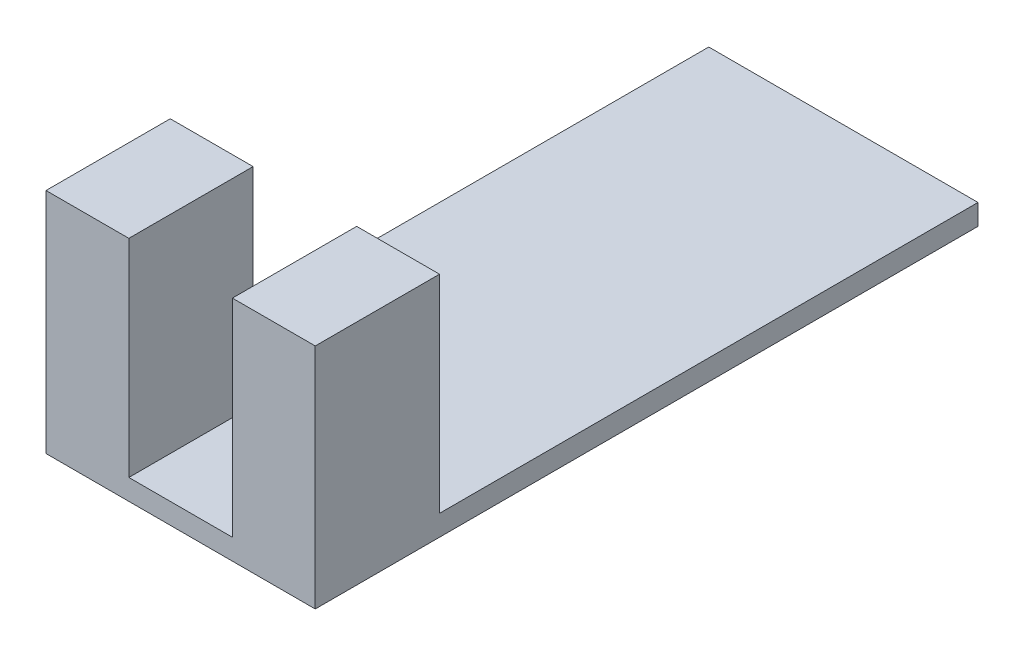
ISO-10303-21;
HEADER;
FILE_DESCRIPTION(('STEP AP214'),'2;1');
FILE_NAME('part.step','',(''),(''),'','','');
FILE_SCHEMA(('AUTOMOTIVE_DESIGN { 1 0 10303 214 1 1 1 1 }'));
ENDSEC;
DATA;
#1=APPLICATION_CONTEXT('core data for automotive mechanical design processes');
#2=APPLICATION_PROTOCOL_DEFINITION('international standard','automotive_design',2000,#1);
#3=PRODUCT_CONTEXT('',#1,'mechanical');
#4=PRODUCT('Part','Part','',(#3));
#5=PRODUCT_RELATED_PRODUCT_CATEGORY('part','',(#4));
#6=PRODUCT_DEFINITION_FORMATION('','',#4);
#7=PRODUCT_DEFINITION_CONTEXT('part definition',#1,'design');
#8=PRODUCT_DEFINITION('design','',#6,#7);
#9=PRODUCT_DEFINITION_SHAPE('','',#8);
#10=(LENGTH_UNIT() NAMED_UNIT(*) SI_UNIT(.MILLI.,.METRE.));
#11=(NAMED_UNIT(*) PLANE_ANGLE_UNIT() SI_UNIT($,.RADIAN.));
#12=(NAMED_UNIT(*) SI_UNIT($,.STERADIAN.) SOLID_ANGLE_UNIT());
#13=UNCERTAINTY_MEASURE_WITH_UNIT(LENGTH_MEASURE(1.E-05),#10,'distance_accuracy_value','');
#14=(GEOMETRIC_REPRESENTATION_CONTEXT(3) GLOBAL_UNCERTAINTY_ASSIGNED_CONTEXT((#13)) GLOBAL_UNIT_ASSIGNED_CONTEXT((#10,
#11,#12)) REPRESENTATION_CONTEXT('',''));
#15=CARTESIAN_POINT('',(0.,0.,0.));
#16=DIRECTION('',(0.,0.,1.));
#17=DIRECTION('',(1.,0.,0.));
#18=AXIS2_PLACEMENT_3D('',#15,#16,#17);
#19=CARTESIAN_POINT('',(0.,1.,0.));
#20=DIRECTION('',(1.,0.,0.));
#21=DIRECTION('',(0.,0.,-1.));
#22=AXIS2_PLACEMENT_3D('',#19,#20,#21);
#23=PLANE('',#22);
#24=DIRECTION('',(0.,0.,1.));
#25=VECTOR('',#24,1.);
#26=CARTESIAN_POINT('',(0.,0.,0.));
#27=LINE('',#26,#25);
#28=CARTESIAN_POINT('',(0.,0.,0.));
#29=VERTEX_POINT('',#28);
#30=CARTESIAN_POINT('',(0.,0.,32.));
#31=VERTEX_POINT('',#30);
#32=EDGE_CURVE('E138',#29,#31,#27,.T.);
#33=ORIENTED_EDGE('',*,*,#32,.T.);
#34=DIRECTION('',(0.,-1.,0.));
#35=VECTOR('',#34,1.);
#36=CARTESIAN_POINT('',(0.,1.,32.));
#37=LINE('',#36,#35);
#38=CARTESIAN_POINT('',(0.,11.,32.));
#39=VERTEX_POINT('',#38);
#40=EDGE_CURVE('E11',#39,#31,#37,.T.);
#41=ORIENTED_EDGE('',*,*,#40,.F.);
#42=DIRECTION('',(0.,0.,1.));
#43=VECTOR('',#42,1.);
#44=CARTESIAN_POINT('',(0.,11.,32.));
#45=LINE('',#44,#43);
#46=CARTESIAN_POINT('',(0.,11.,26.));
#47=VERTEX_POINT('',#46);
#48=EDGE_CURVE('E162',#47,#39,#45,.T.);
#49=ORIENTED_EDGE('',*,*,#48,.F.);
#50=DIRECTION('',(0.,-1.,0.));
#51=VECTOR('',#50,1.);
#52=CARTESIAN_POINT('',(0.,11.,26.));
#53=LINE('',#52,#51);
#54=CARTESIAN_POINT('',(0.,1.,26.));
#55=VERTEX_POINT('',#54);
#56=EDGE_CURVE('E153',#47,#55,#53,.T.);
#57=ORIENTED_EDGE('',*,*,#56,.T.);
#58=DIRECTION('',(0.,0.,1.));
#59=VECTOR('',#58,1.);
#60=CARTESIAN_POINT('',(0.,1.,0.));
#61=LINE('',#60,#59);
#62=CARTESIAN_POINT('',(0.,1.,0.));
#63=VERTEX_POINT('',#62);
#64=EDGE_CURVE('E173',#63,#55,#61,.T.);
#65=ORIENTED_EDGE('',*,*,#64,.F.);
#66=DIRECTION('',(0.,-1.,0.));
#67=VECTOR('',#66,1.);
#68=CARTESIAN_POINT('',(0.,1.,0.));
#69=LINE('',#68,#67);
#70=EDGE_CURVE('E180',#63,#29,#69,.T.);
#71=ORIENTED_EDGE('',*,*,#70,.T.);
#72=EDGE_LOOP('',(#33,#41,#49,#57,#65,#71));
#73=FACE_BOUND('',#72,.T.);
#74=ADVANCED_FACE('F39',(#73),#23,.F.);
#75=CARTESIAN_POINT('',(0.,1.,32.));
#76=DIRECTION('',(0.,0.,-1.));
#77=DIRECTION('',(-1.,0.,0.));
#78=AXIS2_PLACEMENT_3D('',#75,#76,#77);
#79=PLANE('',#78);
#80=DIRECTION('',(1.,0.,0.));
#81=VECTOR('',#80,1.);
#82=CARTESIAN_POINT('',(0.,0.,32.));
#83=LINE('',#82,#81);
#84=CARTESIAN_POINT('',(13.,0.,32.));
#85=VERTEX_POINT('',#84);
#86=EDGE_CURVE('E141',#31,#85,#83,.T.);
#87=ORIENTED_EDGE('',*,*,#86,.T.);
#88=DIRECTION('',(0.,-1.,0.));
#89=VECTOR('',#88,1.);
#90=CARTESIAN_POINT('',(13.,1.,32.));
#91=LINE('',#90,#89);
#92=CARTESIAN_POINT('',(13.,11.,32.));
#93=VERTEX_POINT('',#92);
#94=EDGE_CURVE('E46',#93,#85,#91,.T.);
#95=ORIENTED_EDGE('',*,*,#94,.F.);
#96=DIRECTION('',(1.,0.,0.));
#97=VECTOR('',#96,1.);
#98=CARTESIAN_POINT('',(13.,11.,32.));
#99=LINE('',#98,#97);
#100=CARTESIAN_POINT('',(9.,11.,32.));
#101=VERTEX_POINT('',#100);
#102=EDGE_CURVE('E127',#101,#93,#99,.T.);
#103=ORIENTED_EDGE('',*,*,#102,.F.);
#104=DIRECTION('',(0.,-1.,0.));
#105=VECTOR('',#104,1.);
#106=CARTESIAN_POINT('',(9.,11.,32.));
#107=LINE('',#106,#105);
#108=CARTESIAN_POINT('',(9.,1.,32.));
#109=VERTEX_POINT('',#108);
#110=EDGE_CURVE('E142',#101,#109,#107,.T.);
#111=ORIENTED_EDGE('',*,*,#110,.T.);
#112=DIRECTION('',(1.,0.,0.));
#113=VECTOR('',#112,1.);
#114=CARTESIAN_POINT('',(0.,1.,32.));
#115=LINE('',#114,#113);
#116=CARTESIAN_POINT('',(4.,1.,32.));
#117=VERTEX_POINT('',#116);
#118=EDGE_CURVE('E56',#117,#109,#115,.T.);
#119=ORIENTED_EDGE('',*,*,#118,.F.);
#120=DIRECTION('',(0.,-1.,0.));
#121=VECTOR('',#120,1.);
#122=CARTESIAN_POINT('',(4.,11.,32.));
#123=LINE('',#122,#121);
#124=CARTESIAN_POINT('',(4.,11.,32.));
#125=VERTEX_POINT('',#124);
#126=EDGE_CURVE('E150',#125,#117,#123,.T.);
#127=ORIENTED_EDGE('',*,*,#126,.F.);
#128=DIRECTION('',(1.,0.,0.));
#129=VECTOR('',#128,1.);
#130=CARTESIAN_POINT('',(0.,11.,32.));
#131=LINE('',#130,#129);
#132=EDGE_CURVE('E167',#39,#125,#131,.T.);
#133=ORIENTED_EDGE('',*,*,#132,.F.);
#134=ORIENTED_EDGE('',*,*,#40,.T.);
#135=EDGE_LOOP('',(#87,#95,#103,#111,#119,#127,#133,#134));
#136=FACE_BOUND('',#135,.T.);
#137=ADVANCED_FACE('F213',(#136),#79,.F.);
#138=CARTESIAN_POINT('',(13.,1.,0.));
#139=DIRECTION('',(-1.,0.,0.));
#140=DIRECTION('',(0.,0.,1.));
#141=AXIS2_PLACEMENT_3D('',#138,#139,#140);
#142=PLANE('',#141);
#143=DIRECTION('',(0.,0.,-1.));
#144=VECTOR('',#143,1.);
#145=CARTESIAN_POINT('',(13.,0.,0.));
#146=LINE('',#145,#144);
#147=CARTESIAN_POINT('',(13.,0.,0.));
#148=VERTEX_POINT('',#147);
#149=EDGE_CURVE('E179',#85,#148,#146,.T.);
#150=ORIENTED_EDGE('',*,*,#149,.T.);
#151=DIRECTION('',(0.,-1.,0.));
#152=VECTOR('',#151,1.);
#153=CARTESIAN_POINT('',(13.,1.,0.));
#154=LINE('',#153,#152);
#155=CARTESIAN_POINT('',(13.,1.,0.));
#156=VERTEX_POINT('',#155);
#157=EDGE_CURVE('E184',#156,#148,#154,.T.);
#158=ORIENTED_EDGE('',*,*,#157,.F.);
#159=DIRECTION('',(0.,0.,-1.));
#160=VECTOR('',#159,1.);
#161=CARTESIAN_POINT('',(13.,1.,0.));
#162=LINE('',#161,#160);
#163=CARTESIAN_POINT('',(13.,1.,26.));
#164=VERTEX_POINT('',#163);
#165=EDGE_CURVE('E140',#164,#156,#162,.T.);
#166=ORIENTED_EDGE('',*,*,#165,.F.);
#167=DIRECTION('',(0.,-1.,0.));
#168=VECTOR('',#167,1.);
#169=CARTESIAN_POINT('',(13.,11.,26.));
#170=LINE('',#169,#168);
#171=CARTESIAN_POINT('',(13.,11.,26.));
#172=VERTEX_POINT('',#171);
#173=EDGE_CURVE('E118',#172,#164,#170,.T.);
#174=ORIENTED_EDGE('',*,*,#173,.F.);
#175=DIRECTION('',(0.,0.,-1.));
#176=VECTOR('',#175,1.);
#177=CARTESIAN_POINT('',(13.,11.,32.));
#178=LINE('',#177,#176);
#179=EDGE_CURVE('E125',#93,#172,#178,.T.);
#180=ORIENTED_EDGE('',*,*,#179,.F.);
#181=ORIENTED_EDGE('',*,*,#94,.T.);
#182=EDGE_LOOP('',(#150,#158,#166,#174,#180,#181));
#183=FACE_BOUND('',#182,.T.);
#184=ADVANCED_FACE('F134',(#183),#142,.F.);
#185=CARTESIAN_POINT('',(0.,1.,0.));
#186=DIRECTION('',(0.,0.,1.));
#187=DIRECTION('',(1.,0.,0.));
#188=AXIS2_PLACEMENT_3D('',#185,#186,#187);
#189=PLANE('',#188);
#190=DIRECTION('',(-1.,0.,0.));
#191=VECTOR('',#190,1.);
#192=CARTESIAN_POINT('',(0.,0.,0.));
#193=LINE('',#192,#191);
#194=EDGE_CURVE('E171',#148,#29,#193,.T.);
#195=ORIENTED_EDGE('',*,*,#194,.T.);
#196=ORIENTED_EDGE('',*,*,#70,.F.);
#197=DIRECTION('',(-1.,0.,0.));
#198=VECTOR('',#197,1.);
#199=CARTESIAN_POINT('',(0.,1.,0.));
#200=LINE('',#199,#198);
#201=EDGE_CURVE('E176',#156,#63,#200,.T.);
#202=ORIENTED_EDGE('',*,*,#201,.F.);
#203=ORIENTED_EDGE('',*,*,#157,.T.);
#204=EDGE_LOOP('',(#195,#196,#202,#203));
#205=FACE_BOUND('',#204,.T.);
#206=ADVANCED_FACE('F193',(#205),#189,.F.);
#207=CARTESIAN_POINT('',(0.,1.,0.));
#208=DIRECTION('',(0.,1.,0.));
#209=DIRECTION('',(0.,0.,1.));
#210=AXIS2_PLACEMENT_3D('',#207,#208,#209);
#211=PLANE('',#210);
#212=DIRECTION('',(0.,0.,1.));
#213=VECTOR('',#212,1.);
#214=CARTESIAN_POINT('',(9.,1.,32.));
#215=LINE('',#214,#213);
#216=CARTESIAN_POINT('',(9.,1.,26.));
#217=VERTEX_POINT('',#216);
#218=EDGE_CURVE('E133',#217,#109,#215,.T.);
#219=ORIENTED_EDGE('',*,*,#218,.F.);
#220=DIRECTION('',(-1.,0.,0.));
#221=VECTOR('',#220,1.);
#222=CARTESIAN_POINT('',(13.,1.,26.));
#223=LINE('',#222,#221);
#224=EDGE_CURVE('E52',#164,#217,#223,.T.);
#225=ORIENTED_EDGE('',*,*,#224,.F.);
#226=ORIENTED_EDGE('',*,*,#165,.T.);
#227=ORIENTED_EDGE('',*,*,#201,.T.);
#228=ORIENTED_EDGE('',*,*,#64,.T.);
#229=DIRECTION('',(-1.,0.,0.));
#230=VECTOR('',#229,1.);
#231=CARTESIAN_POINT('',(0.,1.,26.));
#232=LINE('',#231,#230);
#233=CARTESIAN_POINT('',(4.,1.,26.));
#234=VERTEX_POINT('',#233);
#235=EDGE_CURVE('E160',#234,#55,#232,.T.);
#236=ORIENTED_EDGE('',*,*,#235,.F.);
#237=DIRECTION('',(0.,0.,-1.));
#238=VECTOR('',#237,1.);
#239=CARTESIAN_POINT('',(4.,1.,32.));
#240=LINE('',#239,#238);
#241=EDGE_CURVE('E158',#117,#234,#240,.T.);
#242=ORIENTED_EDGE('',*,*,#241,.F.);
#243=ORIENTED_EDGE('',*,*,#118,.T.);
#244=EDGE_LOOP('',(#219,#225,#226,#227,#228,#236,#242,#243));
#245=FACE_BOUND('',#244,.T.);
#246=ADVANCED_FACE('F202',(#245),#211,.T.);
#247=CARTESIAN_POINT('',(0.,0.,0.));
#248=DIRECTION('',(0.,1.,0.));
#249=DIRECTION('',(0.,0.,1.));
#250=AXIS2_PLACEMENT_3D('',#247,#248,#249);
#251=PLANE('',#250);
#252=ORIENTED_EDGE('',*,*,#32,.F.);
#253=ORIENTED_EDGE('',*,*,#194,.F.);
#254=ORIENTED_EDGE('',*,*,#149,.F.);
#255=ORIENTED_EDGE('',*,*,#86,.F.);
#256=EDGE_LOOP('',(#252,#253,#254,#255));
#257=FACE_BOUND('',#256,.T.);
#258=ADVANCED_FACE('F195',(#257),#251,.F.);
#259=CARTESIAN_POINT('',(4.,11.,32.));
#260=DIRECTION('',(-1.,0.,0.));
#261=DIRECTION('',(0.,0.,1.));
#262=AXIS2_PLACEMENT_3D('',#259,#260,#261);
#263=PLANE('',#262);
#264=ORIENTED_EDGE('',*,*,#241,.T.);
#265=DIRECTION('',(0.,-1.,0.));
#266=VECTOR('',#265,1.);
#267=CARTESIAN_POINT('',(4.,11.,26.));
#268=LINE('',#267,#266);
#269=CARTESIAN_POINT('',(4.,11.,26.));
#270=VERTEX_POINT('',#269);
#271=EDGE_CURVE('E148',#270,#234,#268,.T.);
#272=ORIENTED_EDGE('',*,*,#271,.F.);
#273=DIRECTION('',(0.,0.,-1.));
#274=VECTOR('',#273,1.);
#275=CARTESIAN_POINT('',(4.,11.,32.));
#276=LINE('',#275,#274);
#277=EDGE_CURVE('E161',#125,#270,#276,.T.);
#278=ORIENTED_EDGE('',*,*,#277,.F.);
#279=ORIENTED_EDGE('',*,*,#126,.T.);
#280=EDGE_LOOP('',(#264,#272,#278,#279));
#281=FACE_BOUND('',#280,.T.);
#282=ADVANCED_FACE('F208',(#281),#263,.F.);
#283=CARTESIAN_POINT('',(0.,11.,26.));
#284=DIRECTION('',(0.,0.,1.));
#285=DIRECTION('',(1.,0.,0.));
#286=AXIS2_PLACEMENT_3D('',#283,#284,#285);
#287=PLANE('',#286);
#288=ORIENTED_EDGE('',*,*,#235,.T.);
#289=ORIENTED_EDGE('',*,*,#56,.F.);
#290=DIRECTION('',(-1.,0.,0.));
#291=VECTOR('',#290,1.);
#292=CARTESIAN_POINT('',(0.,11.,26.));
#293=LINE('',#292,#291);
#294=EDGE_CURVE('E157',#270,#47,#293,.T.);
#295=ORIENTED_EDGE('',*,*,#294,.F.);
#296=ORIENTED_EDGE('',*,*,#271,.T.);
#297=EDGE_LOOP('',(#288,#289,#295,#296));
#298=FACE_BOUND('',#297,.T.);
#299=ADVANCED_FACE('F201',(#298),#287,.F.);
#300=CARTESIAN_POINT('',(0.,11.,0.));
#301=DIRECTION('',(0.,-1.,0.));
#302=DIRECTION('',(0.,0.,-1.));
#303=AXIS2_PLACEMENT_3D('',#300,#301,#302);
#304=PLANE('',#303);
#305=ORIENTED_EDGE('',*,*,#48,.T.);
#306=ORIENTED_EDGE('',*,*,#132,.T.);
#307=ORIENTED_EDGE('',*,*,#277,.T.);
#308=ORIENTED_EDGE('',*,*,#294,.T.);
#309=EDGE_LOOP('',(#305,#306,#307,#308));
#310=FACE_BOUND('',#309,.T.);
#311=ADVANCED_FACE('F230',(#310),#304,.F.);
#312=CARTESIAN_POINT('',(13.,11.,26.));
#313=DIRECTION('',(0.,0.,1.));
#314=DIRECTION('',(1.,0.,0.));
#315=AXIS2_PLACEMENT_3D('',#312,#313,#314);
#316=PLANE('',#315);
#317=ORIENTED_EDGE('',*,*,#224,.T.);
#318=DIRECTION('',(0.,-1.,0.));
#319=VECTOR('',#318,1.);
#320=CARTESIAN_POINT('',(9.,11.,26.));
#321=LINE('',#320,#319);
#322=CARTESIAN_POINT('',(9.,11.,26.));
#323=VERTEX_POINT('',#322);
#324=EDGE_CURVE('E116',#323,#217,#321,.T.);
#325=ORIENTED_EDGE('',*,*,#324,.F.);
#326=DIRECTION('',(-1.,0.,0.));
#327=VECTOR('',#326,1.);
#328=CARTESIAN_POINT('',(13.,11.,26.));
#329=LINE('',#328,#327);
#330=EDGE_CURVE('E114',#172,#323,#329,.T.);
#331=ORIENTED_EDGE('',*,*,#330,.F.);
#332=ORIENTED_EDGE('',*,*,#173,.T.);
#333=EDGE_LOOP('',(#317,#325,#331,#332));
#334=FACE_BOUND('',#333,.T.);
#335=ADVANCED_FACE('F117',(#334),#316,.F.);
#336=CARTESIAN_POINT('',(9.,11.,32.));
#337=DIRECTION('',(1.,0.,0.));
#338=DIRECTION('',(0.,0.,-1.));
#339=AXIS2_PLACEMENT_3D('',#336,#337,#338);
#340=PLANE('',#339);
#341=ORIENTED_EDGE('',*,*,#218,.T.);
#342=ORIENTED_EDGE('',*,*,#110,.F.);
#343=DIRECTION('',(0.,0.,1.));
#344=VECTOR('',#343,1.);
#345=CARTESIAN_POINT('',(9.,11.,32.));
#346=LINE('',#345,#344);
#347=EDGE_CURVE('E121',#323,#101,#346,.T.);
#348=ORIENTED_EDGE('',*,*,#347,.F.);
#349=ORIENTED_EDGE('',*,*,#324,.T.);
#350=EDGE_LOOP('',(#341,#342,#348,#349));
#351=FACE_BOUND('',#350,.T.);
#352=ADVANCED_FACE('F219',(#351),#340,.F.);
#353=CARTESIAN_POINT('',(0.,11.,0.));
#354=DIRECTION('',(0.,1.,0.));
#355=DIRECTION('',(0.,0.,1.));
#356=AXIS2_PLACEMENT_3D('',#353,#354,#355);
#357=PLANE('',#356);
#358=ORIENTED_EDGE('',*,*,#179,.T.);
#359=ORIENTED_EDGE('',*,*,#330,.T.);
#360=ORIENTED_EDGE('',*,*,#347,.T.);
#361=ORIENTED_EDGE('',*,*,#102,.T.);
#362=EDGE_LOOP('',(#358,#359,#360,#361));
#363=FACE_BOUND('',#362,.T.);
#364=ADVANCED_FACE('F126',(#363),#357,.T.);
#365=CLOSED_SHELL('',(#74,#137,#184,#206,#246,#258,#282,#299,#311,#335,#352,#364));
#366=MANIFOLD_SOLID_BREP('B2',#365);
#367=ADVANCED_BREP_SHAPE_REPRESENTATION('',(#18,#366),#14);
#368=SHAPE_DEFINITION_REPRESENTATION(#9,#367);
ENDSEC;
END-ISO-10303-21;
